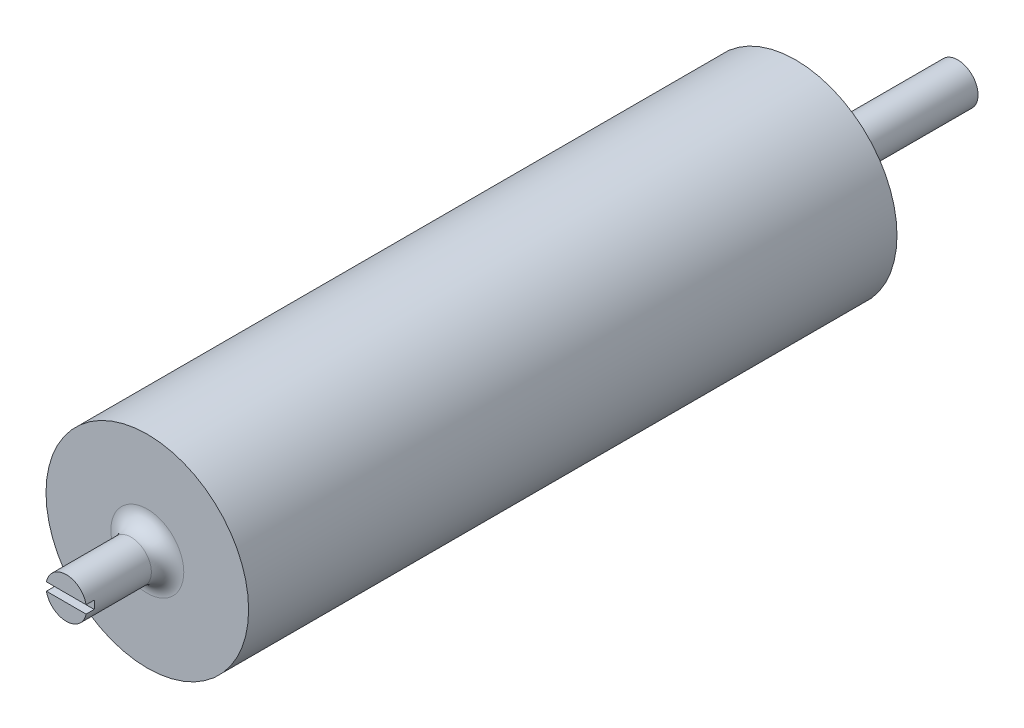
ISO-10303-21;
HEADER;
FILE_DESCRIPTION(('STEP AP214'),'2;1');
FILE_NAME('part.step','',(''),(''),'','','');
FILE_SCHEMA(('AUTOMOTIVE_DESIGN { 1 0 10303 214 1 1 1 1 }'));
ENDSEC;
DATA;
#1=APPLICATION_CONTEXT('core data for automotive mechanical design processes');
#2=APPLICATION_PROTOCOL_DEFINITION('international standard','automotive_design',2000,#1);
#3=PRODUCT_CONTEXT('',#1,'mechanical');
#4=PRODUCT('Part','Part','',(#3));
#5=PRODUCT_RELATED_PRODUCT_CATEGORY('part','',(#4));
#6=PRODUCT_DEFINITION_FORMATION('','',#4);
#7=PRODUCT_DEFINITION_CONTEXT('part definition',#1,'design');
#8=PRODUCT_DEFINITION('design','',#6,#7);
#9=PRODUCT_DEFINITION_SHAPE('','',#8);
#10=(LENGTH_UNIT() NAMED_UNIT(*) SI_UNIT(.MILLI.,.METRE.));
#11=(NAMED_UNIT(*) PLANE_ANGLE_UNIT() SI_UNIT($,.RADIAN.));
#12=(NAMED_UNIT(*) SI_UNIT($,.STERADIAN.) SOLID_ANGLE_UNIT());
#13=UNCERTAINTY_MEASURE_WITH_UNIT(LENGTH_MEASURE(1.E-05),#10,'distance_accuracy_value','');
#14=(GEOMETRIC_REPRESENTATION_CONTEXT(3) GLOBAL_UNCERTAINTY_ASSIGNED_CONTEXT((#13)) GLOBAL_UNIT_ASSIGNED_CONTEXT((#10,
#11,#12)) REPRESENTATION_CONTEXT('',''));
#15=CARTESIAN_POINT('',(0.,0.,0.));
#16=DIRECTION('',(0.,0.,1.));
#17=DIRECTION('',(1.,0.,0.));
#18=AXIS2_PLACEMENT_3D('',#15,#16,#17);
#19=CARTESIAN_POINT('',(0.,0.,90.));
#20=DIRECTION('',(0.,0.,1.));
#21=DIRECTION('',(1.,0.,0.));
#22=AXIS2_PLACEMENT_3D('',#19,#20,#21);
#23=PLANE('',#22);
#24=DIRECTION('',(-1.,0.,0.));
#25=VECTOR('',#24,1.);
#26=CARTESIAN_POINT('',(-2.44948974278318,0.5,90.));
#27=LINE('',#26,#25);
#28=CARTESIAN_POINT('',(2.44948974278318,0.5,90.));
#29=VERTEX_POINT('',#28);
#30=CARTESIAN_POINT('',(-2.44948974278318,0.5,90.));
#31=VERTEX_POINT('',#30);
#32=EDGE_CURVE('E76',#29,#31,#27,.T.);
#33=ORIENTED_EDGE('',*,*,#32,.F.);
#34=CARTESIAN_POINT('',(0.,0.,90.));
#35=DIRECTION('',(0.,0.,1.));
#36=DIRECTION('',(1.,0.,0.));
#37=AXIS2_PLACEMENT_3D('',#34,#35,#36);
#38=CIRCLE('',#37,2.5);
#39=EDGE_CURVE('E122',#29,#31,#38,.T.);
#40=ORIENTED_EDGE('',*,*,#39,.T.);
#41=EDGE_LOOP('',(#33,#40));
#42=FACE_BOUND('',#41,.T.);
#43=ADVANCED_FACE('F38',(#42),#23,.T.);
#44=CARTESIAN_POINT('',(0.,0.,-2.));
#45=DIRECTION('',(0.,0.,1.));
#46=DIRECTION('',(1.,0.,0.));
#47=AXIS2_PLACEMENT_3D('',#44,#45,#46);
#48=TOROIDAL_SURFACE('',#47,4.5,2.);
#49=CARTESIAN_POINT('',(0.,0.,0.));
#50=DIRECTION('',(0.,0.,1.));
#51=DIRECTION('',(1.,0.,0.));
#52=AXIS2_PLACEMENT_3D('',#49,#50,#51);
#53=CIRCLE('',#52,4.5);
#54=CARTESIAN_POINT('',(4.5,0.,0.));
#55=VERTEX_POINT('',#54);
#56=EDGE_CURVE('E46',#55,#55,#53,.T.);
#57=ORIENTED_EDGE('',*,*,#56,.F.);
#58=EDGE_LOOP('',(#57));
#59=FACE_BOUND('',#58,.T.);
#60=CARTESIAN_POINT('',(0.,0.,-1.99999999999999));
#61=DIRECTION('',(0.,0.,1.));
#62=DIRECTION('',(1.,0.,0.));
#63=AXIS2_PLACEMENT_3D('',#60,#61,#62);
#64=CIRCLE('',#63,2.5);
#65=CARTESIAN_POINT('',(-2.5,0.,-1.99999999999999));
#66=VERTEX_POINT('',#65);
#67=EDGE_CURVE('E11',#66,#66,#64,.F.);
#68=ORIENTED_EDGE('',*,*,#67,.F.);
#69=EDGE_LOOP('',(#68));
#70=FACE_BOUND('',#69,.T.);
#71=ADVANCED_FACE('F40',(#59,#70),#48,.F.);
#72=CARTESIAN_POINT('',(0.,0.,82.));
#73=DIRECTION('',(0.,0.,1.));
#74=DIRECTION('',(1.,0.,0.));
#75=AXIS2_PLACEMENT_3D('',#72,#73,#74);
#76=TOROIDAL_SURFACE('',#75,4.5,2.);
#77=CARTESIAN_POINT('',(0.,0.,80.));
#78=DIRECTION('',(0.,0.,1.));
#79=DIRECTION('',(1.,0.,0.));
#80=AXIS2_PLACEMENT_3D('',#77,#78,#79);
#81=CIRCLE('',#80,4.5);
#82=CARTESIAN_POINT('',(4.5,0.,80.));
#83=VERTEX_POINT('',#82);
#84=EDGE_CURVE('E129',#83,#83,#81,.F.);
#85=ORIENTED_EDGE('',*,*,#84,.F.);
#86=EDGE_LOOP('',(#85));
#87=FACE_BOUND('',#86,.T.);
#88=CARTESIAN_POINT('',(0.,0.,82.));
#89=DIRECTION('',(0.,0.,1.));
#90=DIRECTION('',(1.,0.,0.));
#91=AXIS2_PLACEMENT_3D('',#88,#89,#90);
#92=CIRCLE('',#91,2.5);
#93=CARTESIAN_POINT('',(2.5,0.,82.));
#94=VERTEX_POINT('',#93);
#95=EDGE_CURVE('E134',#94,#94,#92,.T.);
#96=ORIENTED_EDGE('',*,*,#95,.F.);
#97=EDGE_LOOP('',(#96));
#98=FACE_BOUND('',#97,.T.);
#99=ADVANCED_FACE('F144',(#87,#98),#76,.F.);
#100=CARTESIAN_POINT('',(0.,0.,80.));
#101=DIRECTION('',(0.,0.,-1.));
#102=DIRECTION('',(-1.,0.,0.));
#103=AXIS2_PLACEMENT_3D('',#100,#101,#102);
#104=CYLINDRICAL_SURFACE('',#103,12.5);
#105=CARTESIAN_POINT('',(0.,0.,80.));
#106=DIRECTION('',(0.,0.,1.));
#107=DIRECTION('',(1.,0.,0.));
#108=AXIS2_PLACEMENT_3D('',#105,#106,#107);
#109=CIRCLE('',#108,12.5);
#110=CARTESIAN_POINT('',(12.5,0.,80.));
#111=VERTEX_POINT('',#110);
#112=EDGE_CURVE('E126',#111,#111,#109,.T.);
#113=ORIENTED_EDGE('',*,*,#112,.F.);
#114=EDGE_LOOP('',(#113));
#115=FACE_BOUND('',#114,.T.);
#116=CARTESIAN_POINT('',(0.,0.,0.));
#117=DIRECTION('',(0.,0.,1.));
#118=DIRECTION('',(1.,0.,0.));
#119=AXIS2_PLACEMENT_3D('',#116,#117,#118);
#120=CIRCLE('',#119,12.5);
#121=CARTESIAN_POINT('',(12.5,0.,0.));
#122=VERTEX_POINT('',#121);
#123=EDGE_CURVE('E125',#122,#122,#120,.T.);
#124=ORIENTED_EDGE('',*,*,#123,.T.);
#125=EDGE_LOOP('',(#124));
#126=FACE_BOUND('',#125,.T.);
#127=ADVANCED_FACE('F180',(#115,#126),#104,.T.);
#128=CARTESIAN_POINT('',(0.,0.,80.));
#129=DIRECTION('',(0.,0.,1.));
#130=DIRECTION('',(1.,0.,0.));
#131=AXIS2_PLACEMENT_3D('',#128,#129,#130);
#132=PLANE('',#131);
#133=ORIENTED_EDGE('',*,*,#84,.T.);
#134=EDGE_LOOP('',(#133));
#135=FACE_BOUND('',#134,.T.);
#136=ORIENTED_EDGE('',*,*,#112,.T.);
#137=EDGE_LOOP('',(#136));
#138=FACE_BOUND('',#137,.T.);
#139=ADVANCED_FACE('F159',(#135,#138),#132,.T.);
#140=CARTESIAN_POINT('',(0.,0.,0.));
#141=DIRECTION('',(0.,0.,1.));
#142=DIRECTION('',(1.,0.,0.));
#143=AXIS2_PLACEMENT_3D('',#140,#141,#142);
#144=PLANE('',#143);
#145=ORIENTED_EDGE('',*,*,#56,.T.);
#146=EDGE_LOOP('',(#145));
#147=FACE_BOUND('',#146,.T.);
#148=ORIENTED_EDGE('',*,*,#123,.F.);
#149=EDGE_LOOP('',(#148));
#150=FACE_BOUND('',#149,.T.);
#151=ADVANCED_FACE('F139',(#147,#150),#144,.F.);
#152=CARTESIAN_POINT('',(0.,0.,-20.));
#153=DIRECTION('',(0.,0.,1.));
#154=DIRECTION('',(1.,0.,0.));
#155=AXIS2_PLACEMENT_3D('',#152,#153,#154);
#156=PLANE('',#155);
#157=CARTESIAN_POINT('',(0.,0.,-20.));
#158=DIRECTION('',(0.,0.,1.));
#159=DIRECTION('',(1.,0.,0.));
#160=AXIS2_PLACEMENT_3D('',#157,#158,#159);
#161=CIRCLE('',#160,2.5);
#162=CARTESIAN_POINT('',(-2.5,0.,-20.));
#163=VERTEX_POINT('',#162);
#164=EDGE_CURVE('E116',#163,#163,#161,.T.);
#165=ORIENTED_EDGE('',*,*,#164,.F.);
#166=EDGE_LOOP('',(#165));
#167=FACE_BOUND('',#166,.T.);
#168=ADVANCED_FACE('F150',(#167),#156,.F.);
#169=CARTESIAN_POINT('',(0.,0.,90.));
#170=DIRECTION('',(0.,0.,-1.));
#171=DIRECTION('',(-1.,0.,0.));
#172=AXIS2_PLACEMENT_3D('',#169,#170,#171);
#173=CYLINDRICAL_SURFACE('',#172,2.5);
#174=CARTESIAN_POINT('',(-2.5,0.,-1.99999999999999));
#175=CARTESIAN_POINT('',(-2.5,0.,-2.18749999999999));
#176=CARTESIAN_POINT('',(-2.5,0.,-2.37499999999998));
#177=CARTESIAN_POINT('',(-2.5,0.,-2.74999999999998));
#178=CARTESIAN_POINT('',(-2.5,0.,-2.93749999999999));
#179=CARTESIAN_POINT('',(-2.5,0.,-3.31249999999999));
#180=CARTESIAN_POINT('',(-2.5,0.,-3.49999999999999));
#181=CARTESIAN_POINT('',(-2.5,0.,-3.87499999999999));
#182=CARTESIAN_POINT('',(-2.5,0.,-4.06249999999999));
#183=CARTESIAN_POINT('',(-2.5,0.,-4.43749999999999));
#184=CARTESIAN_POINT('',(-2.5,0.,-4.62499999999999));
#185=CARTESIAN_POINT('',(-2.5,0.,-4.99999999999999));
#186=CARTESIAN_POINT('',(-2.5,0.,-5.18749999999999));
#187=CARTESIAN_POINT('',(-2.5,0.,-5.56249999999999));
#188=CARTESIAN_POINT('',(-2.5,0.,-5.75));
#189=CARTESIAN_POINT('',(-2.5,0.,-6.125));
#190=CARTESIAN_POINT('',(-2.5,0.,-6.31249999999999));
#191=CARTESIAN_POINT('',(-2.5,0.,-6.68749999999999));
#192=CARTESIAN_POINT('',(-2.5,0.,-6.87499999999999));
#193=CARTESIAN_POINT('',(-2.5,0.,-7.24999999999999));
#194=CARTESIAN_POINT('',(-2.5,0.,-7.43749999999999));
#195=CARTESIAN_POINT('',(-2.5,0.,-7.8125));
#196=CARTESIAN_POINT('',(-2.5,0.,-8.));
#197=CARTESIAN_POINT('',(-2.5,0.,-8.375));
#198=CARTESIAN_POINT('',(-2.5,0.,-8.56249999999999));
#199=CARTESIAN_POINT('',(-2.5,0.,-8.93749999999999));
#200=CARTESIAN_POINT('',(-2.5,0.,-9.12499999999999));
#201=CARTESIAN_POINT('',(-2.5,0.,-9.49999999999999));
#202=CARTESIAN_POINT('',(-2.5,0.,-9.68749999999999));
#203=CARTESIAN_POINT('',(-2.5,0.,-10.0625));
#204=CARTESIAN_POINT('',(-2.5,0.,-10.25));
#205=CARTESIAN_POINT('',(-2.5,0.,-10.625));
#206=CARTESIAN_POINT('',(-2.5,0.,-10.8125));
#207=CARTESIAN_POINT('',(-2.5,0.,-11.1875));
#208=CARTESIAN_POINT('',(-2.5,0.,-11.375));
#209=CARTESIAN_POINT('',(-2.5,0.,-11.75));
#210=CARTESIAN_POINT('',(-2.5,0.,-11.9375));
#211=CARTESIAN_POINT('',(-2.5,0.,-12.3125));
#212=CARTESIAN_POINT('',(-2.5,0.,-12.5));
#213=CARTESIAN_POINT('',(-2.5,0.,-12.875));
#214=CARTESIAN_POINT('',(-2.5,0.,-13.0625));
#215=CARTESIAN_POINT('',(-2.5,0.,-13.4375));
#216=CARTESIAN_POINT('',(-2.5,0.,-13.625));
#217=CARTESIAN_POINT('',(-2.5,0.,-14.));
#218=CARTESIAN_POINT('',(-2.5,0.,-14.1875));
#219=CARTESIAN_POINT('',(-2.5,0.,-14.5625));
#220=CARTESIAN_POINT('',(-2.5,0.,-14.75));
#221=CARTESIAN_POINT('',(-2.5,0.,-15.125));
#222=CARTESIAN_POINT('',(-2.5,0.,-15.3125));
#223=CARTESIAN_POINT('',(-2.5,0.,-15.6875));
#224=CARTESIAN_POINT('',(-2.5,0.,-15.875));
#225=CARTESIAN_POINT('',(-2.5,0.,-16.25));
#226=CARTESIAN_POINT('',(-2.5,0.,-16.4375));
#227=CARTESIAN_POINT('',(-2.5,0.,-16.8125));
#228=CARTESIAN_POINT('',(-2.5,0.,-17.));
#229=CARTESIAN_POINT('',(-2.5,0.,-17.375));
#230=CARTESIAN_POINT('',(-2.5,0.,-17.5625));
#231=CARTESIAN_POINT('',(-2.5,0.,-17.9375));
#232=CARTESIAN_POINT('',(-2.5,0.,-18.125));
#233=CARTESIAN_POINT('',(-2.5,0.,-18.5));
#234=CARTESIAN_POINT('',(-2.5,0.,-18.6875));
#235=CARTESIAN_POINT('',(-2.5,0.,-19.0625));
#236=CARTESIAN_POINT('',(-2.5,0.,-19.25));
#237=CARTESIAN_POINT('',(-2.5,0.,-19.625));
#238=CARTESIAN_POINT('',(-2.5,0.,-19.8125));
#239=CARTESIAN_POINT('',(-2.5,0.,-20.));
#240=B_SPLINE_CURVE_WITH_KNOTS('',3,(#174,#175,#176,#177,#178,#179,#180,#181,#182,#183,#184,
#185,#186,#187,#188,#189,#190,#191,#192,#193,#194,#195,#196,#197,#198,#199,#200,#201,#202,#203,
#204,#205,#206,#207,#208,#209,#210,#211,#212,#213,#214,#215,#216,#217,#218,#219,#220,#221,#222,
#223,#224,#225,#226,#227,#228,#229,#230,#231,#232,#233,#234,#235,#236,#237,#238,#239),
.UNSPECIFIED.,.F.,.F.,(4,2,2,2,2,2,2,2,2,2,2,2,2,2,2,2,2,2,2,2,2,2,2,2,2,2,2,2,2,2,2,2,4),(0.,
0.562499999999994,1.125,1.68750000000001,2.25,2.8125,3.375,3.93750000000001,4.5,5.0625,
5.62500000000001,6.18750000000001,6.75000000000001,7.3125,7.87500000000001,8.43750000000001,
9.00000000000001,9.5625,10.125,10.6875,11.25,11.8125,12.375,12.9375,13.5,14.0625,14.625,15.1875,
15.75,16.3125,16.875,17.4375,18.),.UNSPECIFIED.);
#241=EDGE_CURVE('BSEAM147',#66,#163,#240,.T.);
#242=ORIENTED_EDGE('',*,*,#67,.T.);
#243=ORIENTED_EDGE('',*,*,#164,.T.);
#244=ORIENTED_EDGE('',*,*,#241,.T.);
#245=ORIENTED_EDGE('',*,*,#241,.F.);
#246=EDGE_LOOP('',(#242,#244,#243,#245));
#247=FACE_BOUND('',#246,.T.);
#248=ADVANCED_FACE('F147',(#247),#173,.T.);
#249=CARTESIAN_POINT('',(0.,0.,89.));
#250=DIRECTION('',(0.,0.,1.));
#251=DIRECTION('',(1.,0.,0.));
#252=AXIS2_PLACEMENT_3D('',#249,#250,#251);
#253=CIRCLE('',#252,2.5);
#254=CARTESIAN_POINT('',(-2.44948974278318,0.5,89.));
#255=VERTEX_POINT('',#254);
#256=CARTESIAN_POINT('',(-2.44948974278318,-0.5,89.));
#257=VERTEX_POINT('',#256);
#258=EDGE_CURVE('E96',#255,#257,#253,.T.);
#259=ORIENTED_EDGE('',*,*,#258,.F.);
#260=DIRECTION('',(0.,0.,1.));
#261=VECTOR('',#260,1.);
#262=CARTESIAN_POINT('',(-2.44948974278318,0.5,89.));
#263=LINE('',#262,#261);
#264=EDGE_CURVE('E62',#255,#31,#263,.T.);
#265=ORIENTED_EDGE('',*,*,#264,.T.);
#266=ORIENTED_EDGE('',*,*,#39,.F.);
#267=DIRECTION('',(0.,0.,1.));
#268=VECTOR('',#267,1.);
#269=CARTESIAN_POINT('',(2.44948974278318,0.5,89.));
#270=LINE('',#269,#268);
#271=CARTESIAN_POINT('',(2.44948974278318,0.5,89.));
#272=VERTEX_POINT('',#271);
#273=EDGE_CURVE('E90',#272,#29,#270,.T.);
#274=ORIENTED_EDGE('',*,*,#273,.F.);
#275=CARTESIAN_POINT('',(0.,0.,89.));
#276=DIRECTION('',(0.,0.,1.));
#277=DIRECTION('',(1.,0.,0.));
#278=AXIS2_PLACEMENT_3D('',#275,#276,#277);
#279=CIRCLE('',#278,2.5);
#280=CARTESIAN_POINT('',(2.44948974278318,-0.5,89.));
#281=VERTEX_POINT('',#280);
#282=EDGE_CURVE('E94',#281,#272,#279,.T.);
#283=ORIENTED_EDGE('',*,*,#282,.F.);
#284=DIRECTION('',(0.,0.,1.));
#285=VECTOR('',#284,1.);
#286=CARTESIAN_POINT('',(2.44948974278318,-0.5,89.));
#287=LINE('',#286,#285);
#288=CARTESIAN_POINT('',(2.44948974278318,-0.5,90.));
#289=VERTEX_POINT('',#288);
#290=EDGE_CURVE('E83',#281,#289,#287,.T.);
#291=ORIENTED_EDGE('',*,*,#290,.T.);
#292=CARTESIAN_POINT('',(-2.44948974278318,-0.5,90.));
#293=VERTEX_POINT('',#292);
#294=EDGE_CURVE('E121',#293,#289,#38,.T.);
#295=ORIENTED_EDGE('',*,*,#294,.F.);
#296=DIRECTION('',(0.,0.,1.));
#297=VECTOR('',#296,1.);
#298=CARTESIAN_POINT('',(-2.44948974278318,-0.5,89.));
#299=LINE('',#298,#297);
#300=EDGE_CURVE('E53',#257,#293,#299,.T.);
#301=ORIENTED_EDGE('',*,*,#300,.F.);
#302=EDGE_LOOP('',(#259,#265,#266,#274,#283,#291,#295,#301));
#303=FACE_BOUND('',#302,.T.);
#304=ORIENTED_EDGE('',*,*,#95,.T.);
#305=EDGE_LOOP('',(#304));
#306=FACE_BOUND('',#305,.T.);
#307=ADVANCED_FACE('F99',(#303,#306),#173,.T.);
#308=DIRECTION('',(1.,0.,0.));
#309=VECTOR('',#308,1.);
#310=CARTESIAN_POINT('',(-2.44948974278318,-0.5,90.));
#311=LINE('',#310,#309);
#312=EDGE_CURVE('E85',#293,#289,#311,.T.);
#313=ORIENTED_EDGE('',*,*,#312,.F.);
#314=ORIENTED_EDGE('',*,*,#294,.T.);
#315=EDGE_LOOP('',(#313,#314));
#316=FACE_BOUND('',#315,.T.);
#317=ADVANCED_FACE('F165',(#316),#23,.T.);
#318=CARTESIAN_POINT('',(-2.44948974278318,0.5,89.));
#319=DIRECTION('',(0.,1.,0.));
#320=DIRECTION('',(0.,0.,1.));
#321=AXIS2_PLACEMENT_3D('',#318,#319,#320);
#322=PLANE('',#321);
#323=ORIENTED_EDGE('',*,*,#32,.T.);
#324=ORIENTED_EDGE('',*,*,#264,.F.);
#325=DIRECTION('',(-1.,0.,0.));
#326=VECTOR('',#325,1.);
#327=CARTESIAN_POINT('',(-2.44948974278318,0.5,89.));
#328=LINE('',#327,#326);
#329=EDGE_CURVE('E102',#272,#255,#328,.T.);
#330=ORIENTED_EDGE('',*,*,#329,.F.);
#331=ORIENTED_EDGE('',*,*,#273,.T.);
#332=EDGE_LOOP('',(#323,#324,#330,#331));
#333=FACE_BOUND('',#332,.T.);
#334=ADVANCED_FACE('F169',(#333),#322,.F.);
#335=CARTESIAN_POINT('',(-2.44948974278318,-0.5,89.));
#336=DIRECTION('',(0.,-1.,0.));
#337=DIRECTION('',(0.,0.,-1.));
#338=AXIS2_PLACEMENT_3D('',#335,#336,#337);
#339=PLANE('',#338);
#340=ORIENTED_EDGE('',*,*,#312,.T.);
#341=ORIENTED_EDGE('',*,*,#290,.F.);
#342=DIRECTION('',(1.,0.,0.));
#343=VECTOR('',#342,1.);
#344=CARTESIAN_POINT('',(-2.44948974278318,-0.5,89.));
#345=LINE('',#344,#343);
#346=EDGE_CURVE('E80',#257,#281,#345,.T.);
#347=ORIENTED_EDGE('',*,*,#346,.F.);
#348=ORIENTED_EDGE('',*,*,#300,.T.);
#349=EDGE_LOOP('',(#340,#341,#347,#348));
#350=FACE_BOUND('',#349,.T.);
#351=ADVANCED_FACE('F84',(#350),#339,.F.);
#352=CARTESIAN_POINT('',(0.,0.,89.));
#353=DIRECTION('',(0.,0.,1.));
#354=DIRECTION('',(1.,0.,0.));
#355=AXIS2_PLACEMENT_3D('',#352,#353,#354);
#356=PLANE('',#355);
#357=ORIENTED_EDGE('',*,*,#258,.T.);
#358=ORIENTED_EDGE('',*,*,#346,.T.);
#359=ORIENTED_EDGE('',*,*,#282,.T.);
#360=ORIENTED_EDGE('',*,*,#329,.T.);
#361=EDGE_LOOP('',(#357,#358,#359,#360));
#362=FACE_BOUND('',#361,.T.);
#363=ADVANCED_FACE('F93',(#362),#356,.T.);
#364=CLOSED_SHELL('',(#43,#71,#99,#127,#139,#151,#168,#248,#307,#317,#334,#351,#363));
#365=CARTESIAN_POINT('',(0.,0.,-5.));
#366=DIRECTION('',(0.,0.,1.));
#367=DIRECTION('',(1.,0.,0.));
#368=AXIS2_PLACEMENT_3D('',#365,#366,#367);
#369=CYLINDRICAL_SURFACE('',#368,0.5);
#370=CARTESIAN_POINT('',(0.,0.,-5.));
#371=DIRECTION('',(0.,0.,1.));
#372=DIRECTION('',(1.,0.,0.));
#373=AXIS2_PLACEMENT_3D('',#370,#371,#372);
#374=CIRCLE('',#373,0.5);
#375=CARTESIAN_POINT('',(0.5,0.,-5.));
#376=VERTEX_POINT('',#375);
#377=EDGE_CURVE('E113',#376,#376,#374,.T.);
#378=ORIENTED_EDGE('',*,*,#377,.F.);
#379=EDGE_LOOP('',(#378));
#380=FACE_BOUND('',#379,.T.);
#381=CARTESIAN_POINT('',(0.,0.,85.));
#382=DIRECTION('',(0.,0.,1.));
#383=DIRECTION('',(1.,0.,0.));
#384=AXIS2_PLACEMENT_3D('',#381,#382,#383);
#385=CIRCLE('',#384,0.5);
#386=CARTESIAN_POINT('',(0.5,0.,85.));
#387=VERTEX_POINT('',#386);
#388=EDGE_CURVE('E110',#387,#387,#385,.T.);
#389=ORIENTED_EDGE('',*,*,#388,.T.);
#390=EDGE_LOOP('',(#389));
#391=FACE_BOUND('',#390,.T.);
#392=ADVANCED_FACE('F225',(#380,#391),#369,.F.);
#393=CARTESIAN_POINT('',(0.,0.,-5.));
#394=DIRECTION('',(0.,0.,1.));
#395=DIRECTION('',(1.,0.,0.));
#396=AXIS2_PLACEMENT_3D('',#393,#394,#395);
#397=PLANE('',#396);
#398=ORIENTED_EDGE('',*,*,#377,.T.);
#399=EDGE_LOOP('',(#398));
#400=FACE_BOUND('',#399,.T.);
#401=ADVANCED_FACE('F230',(#400),#397,.T.);
#402=CARTESIAN_POINT('',(0.,0.,85.));
#403=DIRECTION('',(0.,0.,1.));
#404=DIRECTION('',(1.,0.,0.));
#405=AXIS2_PLACEMENT_3D('',#402,#403,#404);
#406=PLANE('',#405);
#407=ORIENTED_EDGE('',*,*,#388,.F.);
#408=EDGE_LOOP('',(#407));
#409=FACE_BOUND('',#408,.T.);
#410=ADVANCED_FACE('F241',(#409),#406,.F.);
#411=CLOSED_SHELL('',(#392,#401,#410));
#412=ORIENTED_CLOSED_SHELL('',*,#411,.T.);
#413=BREP_WITH_VOIDS('B2',#364,(#412));
#414=ADVANCED_BREP_SHAPE_REPRESENTATION('',(#18,#413),#14);
#415=SHAPE_DEFINITION_REPRESENTATION(#9,#414);
ENDSEC;
END-ISO-10303-21;
